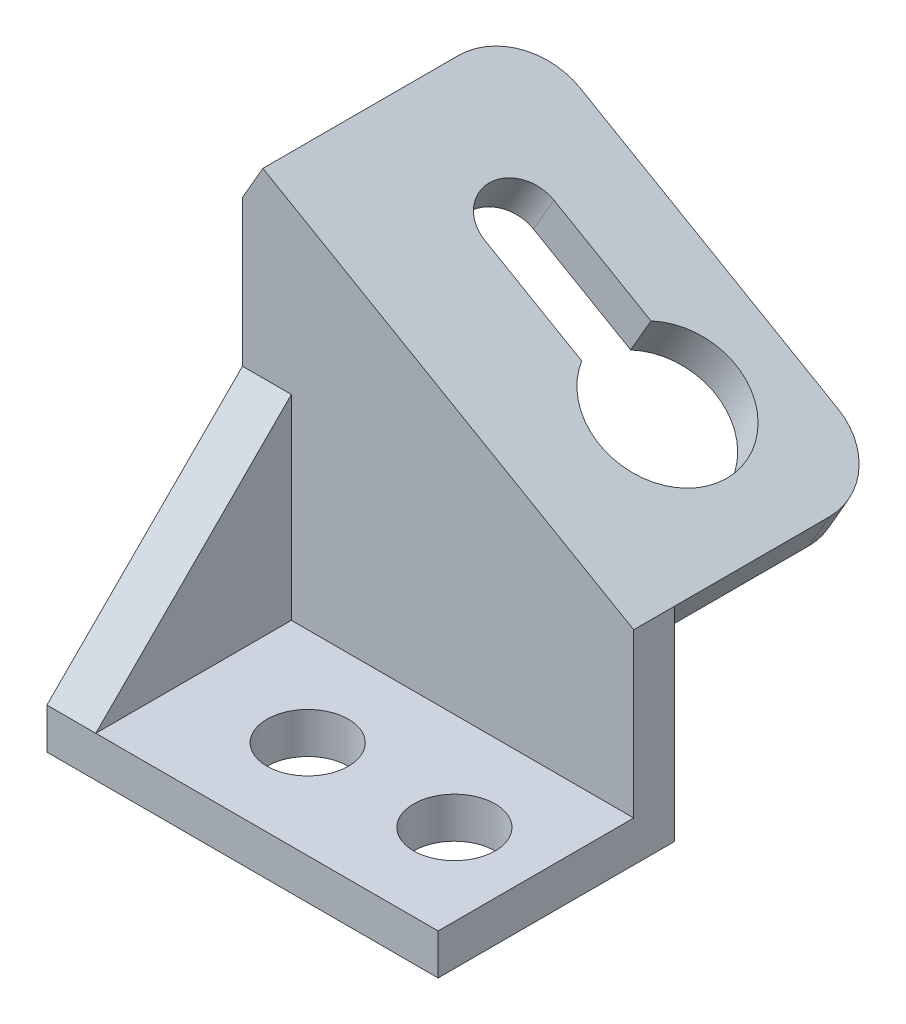
ISO-10303-21;
HEADER;
FILE_DESCRIPTION(('STEP AP214'),'2;1');
FILE_NAME('part.step','',(''),(''),'','','');
FILE_SCHEMA(('AUTOMOTIVE_DESIGN { 1 0 10303 214 1 1 1 1 }'));
ENDSEC;
DATA;
#1=APPLICATION_CONTEXT('core data for automotive mechanical design processes');
#2=APPLICATION_PROTOCOL_DEFINITION('international standard','automotive_design',2000,#1);
#3=PRODUCT_CONTEXT('',#1,'mechanical');
#4=PRODUCT('Part','Part','',(#3));
#5=PRODUCT_RELATED_PRODUCT_CATEGORY('part','',(#4));
#6=PRODUCT_DEFINITION_FORMATION('','',#4);
#7=PRODUCT_DEFINITION_CONTEXT('part definition',#1,'design');
#8=PRODUCT_DEFINITION('design','',#6,#7);
#9=PRODUCT_DEFINITION_SHAPE('','',#8);
#10=(LENGTH_UNIT() NAMED_UNIT(*) SI_UNIT(.MILLI.,.METRE.));
#11=(NAMED_UNIT(*) PLANE_ANGLE_UNIT() SI_UNIT($,.RADIAN.));
#12=(NAMED_UNIT(*) SI_UNIT($,.STERADIAN.) SOLID_ANGLE_UNIT());
#13=UNCERTAINTY_MEASURE_WITH_UNIT(LENGTH_MEASURE(1.E-05),#10,'distance_accuracy_value','');
#14=(GEOMETRIC_REPRESENTATION_CONTEXT(3) GLOBAL_UNCERTAINTY_ASSIGNED_CONTEXT((#13)) GLOBAL_UNIT_ASSIGNED_CONTEXT((#10,
#11,#12)) REPRESENTATION_CONTEXT('',''));
#15=CARTESIAN_POINT('',(0.,0.,0.));
#16=DIRECTION('',(0.,0.,1.));
#17=DIRECTION('',(1.,0.,0.));
#18=AXIS2_PLACEMENT_3D('',#15,#16,#17);
#19=CARTESIAN_POINT('',(32.7981532850781,56.8080678841871,0.));
#20=DIRECTION('',(0.500000000000001,0.866025403784438,0.));
#21=DIRECTION('',(-0.866025403784438,0.500000000000001,0.));
#22=AXIS2_PLACEMENT_3D('',#19,#20,#21);
#23=PLANE('',#22);
#24=DIRECTION('',(0.866025403784438,-0.500000000000001,0.));
#25=VECTOR('',#24,1.);
#26=CARTESIAN_POINT('',(-1.17961196366423E-13,75.7440905122497,-50.8));
#27=LINE('',#26,#25);
#28=CARTESIAN_POINT('',(14.9672726280624,67.1027316314033,-50.8));
#29=VERTEX_POINT('',#28);
#30=CARTESIAN_POINT('',(65.2014773719377,38.1,-50.8));
#31=VERTEX_POINT('',#30);
#32=EDGE_CURVE('E204',#29,#31,#27,.T.);
#33=ORIENTED_EDGE('',*,*,#32,.F.);
#34=CARTESIAN_POINT('',(14.9672726280623,67.1027316314033,-38.1));
#35=DIRECTION('',(0.500000000000001,0.866025403784438,0.));
#36=DIRECTION('',(-0.866025403784438,0.500000000000001,0.));
#37=AXIS2_PLACEMENT_3D('',#34,#35,#36);
#38=CIRCLE('',#37,12.7);
#39=CARTESIAN_POINT('',(3.96874999999997,73.4527316314033,-38.1));
#40=VERTEX_POINT('',#39);
#41=EDGE_CURVE('E274',#29,#40,#38,.T.);
#42=ORIENTED_EDGE('',*,*,#41,.T.);
#43=DIRECTION('',(0.,0.,-1.));
#44=VECTOR('',#43,1.);
#45=CARTESIAN_POINT('',(3.96874999999997,73.4527316314033,0.));
#46=LINE('',#45,#44);
#47=CARTESIAN_POINT('',(3.96874999999997,73.4527316314033,0.));
#48=VERTEX_POINT('',#47);
#49=EDGE_CURVE('E196',#48,#40,#46,.T.);
#50=ORIENTED_EDGE('',*,*,#49,.F.);
#51=DIRECTION('',(0.866025403784438,-0.500000000000001,0.));
#52=VECTOR('',#51,1.);
#53=CARTESIAN_POINT('',(-26.2151226684888,90.8793986417407,0.));
#54=LINE('',#53,#52);
#55=CARTESIAN_POINT('',(76.2,31.75,0.));
#56=VERTEX_POINT('',#55);
#57=EDGE_CURVE('E216',#48,#56,#54,.T.);
#58=ORIENTED_EDGE('',*,*,#57,.T.);
#59=DIRECTION('',(0.,0.,-1.));
#60=VECTOR('',#59,1.);
#61=CARTESIAN_POINT('',(76.2,31.75,0.));
#62=LINE('',#61,#60);
#63=CARTESIAN_POINT('',(76.2,31.75,-7.9375));
#64=VERTEX_POINT('',#63);
#65=EDGE_CURVE('E231',#56,#64,#62,.T.);
#66=ORIENTED_EDGE('',*,*,#65,.T.);
#67=DIRECTION('',(0.,0.,-1.));
#68=VECTOR('',#67,1.);
#69=CARTESIAN_POINT('',(76.2,31.75,0.));
#70=LINE('',#69,#68);
#71=CARTESIAN_POINT('',(76.2000000000001,31.75,-38.1));
#72=VERTEX_POINT('',#71);
#73=EDGE_CURVE('E199',#64,#72,#70,.T.);
#74=ORIENTED_EDGE('',*,*,#73,.T.);
#75=CARTESIAN_POINT('',(65.2014773719377,38.1,-38.1));
#76=DIRECTION('',(0.500000000000001,0.866025403784438,0.));
#77=DIRECTION('',(-0.866025403784438,0.500000000000001,0.));
#78=AXIS2_PLACEMENT_3D('',#75,#76,#77);
#79=CIRCLE('',#78,12.7);
#80=EDGE_CURVE('E272',#72,#31,#79,.T.);
#81=ORIENTED_EDGE('',*,*,#80,.T.);
#82=EDGE_LOOP('',(#33,#42,#50,#58,#66,#74,#81));
#83=FACE_BOUND('',#82,.T.);
#84=DIRECTION('',(0.866025403784438,-0.500000000000001,0.));
#85=VECTOR('',#84,1.);
#86=CARTESIAN_POINT('',(25.3318328451399,61.1187499998759,-21.828125));
#87=LINE('',#86,#85);
#88=CARTESIAN_POINT('',(25.3318328454266,61.1187499998759,-21.828125));
#89=VERTEX_POINT('',#88);
#90=CARTESIAN_POINT('',(44.2417084838831,50.2011282095052,-21.828125));
#91=VERTEX_POINT('',#90);
#92=EDGE_CURVE('E165',#89,#91,#87,.T.);
#93=ORIENTED_EDGE('',*,*,#92,.F.);
#94=CARTESIAN_POINT('',(25.3318328451399,61.1187499998759,-28.575));
#95=DIRECTION('',(-0.500000000000001,-0.866025403784438,0.));
#96=DIRECTION('',(0.866025403784438,-0.500000000000001,0.));
#97=AXIS2_PLACEMENT_3D('',#94,#95,#96);
#98=CIRCLE('',#97,6.746875);
#99=CARTESIAN_POINT('',(25.3318328451399,61.1187499998759,-35.321875));
#100=VERTEX_POINT('',#99);
#101=EDGE_CURVE('E47',#89,#100,#98,.T.);
#102=ORIENTED_EDGE('',*,*,#101,.T.);
#103=DIRECTION('',(0.866025403784438,-0.500000000000001,0.));
#104=VECTOR('',#103,1.);
#105=CARTESIAN_POINT('',(25.3318328451399,61.1187499998759,-35.321875));
#106=LINE('',#105,#104);
#107=CARTESIAN_POINT('',(44.2417084838831,50.2011282095052,-35.321875));
#108=VERTEX_POINT('',#107);
#109=EDGE_CURVE('E156',#100,#108,#106,.T.);
#110=ORIENTED_EDGE('',*,*,#109,.T.);
#111=CARTESIAN_POINT('',(54.2029547438036,44.4499999998759,-28.575));
#112=DIRECTION('',(-0.500000000000001,-0.866025403784438,0.));
#113=DIRECTION('',(0.866025403784438,-0.500000000000001,0.));
#114=AXIS2_PLACEMENT_3D('',#111,#112,#113);
#115=CIRCLE('',#114,13.335);
#116=EDGE_CURVE('E162',#108,#91,#115,.T.);
#117=ORIENTED_EDGE('',*,*,#116,.T.);
#118=EDGE_LOOP('',(#93,#102,#110,#117));
#119=FACE_BOUND('',#118,.T.);
#120=ADVANCED_FACE('F32',(#83,#119),#23,.T.);
#121=CARTESIAN_POINT('',(72.23125,24.875923357461,0.));
#122=DIRECTION('',(0.500000000000001,0.866025403784438,0.));
#123=DIRECTION('',(-0.866025403784438,0.500000000000001,0.));
#124=AXIS2_PLACEMENT_3D('',#121,#122,#123);
#125=PLANE('',#124);
#126=DIRECTION('',(0.,0.,1.));
#127=VECTOR('',#126,1.);
#128=CARTESIAN_POINT('',(0.,66.5786549888643,0.));
#129=LINE('',#128,#127);
#130=CARTESIAN_POINT('',(0.,66.5786549888643,-38.1));
#131=VERTEX_POINT('',#130);
#132=CARTESIAN_POINT('',(0.,66.5786549888643,-7.9375));
#133=VERTEX_POINT('',#132);
#134=EDGE_CURVE('E259',#131,#133,#129,.T.);
#135=ORIENTED_EDGE('',*,*,#134,.F.);
#136=CARTESIAN_POINT('',(10.9985226280623,60.2286549888643,-38.1));
#137=DIRECTION('',(0.500000000000001,0.866025403784438,0.));
#138=DIRECTION('',(-0.866025403784438,0.500000000000001,0.));
#139=AXIS2_PLACEMENT_3D('',#136,#137,#138);
#140=CIRCLE('',#139,12.7);
#141=CARTESIAN_POINT('',(10.9985226280623,60.2286549888643,-50.8));
#142=VERTEX_POINT('',#141);
#143=EDGE_CURVE('E266',#131,#142,#140,.F.);
#144=ORIENTED_EDGE('',*,*,#143,.T.);
#145=DIRECTION('',(0.866025403784438,-0.500000000000001,0.));
#146=VECTOR('',#145,1.);
#147=CARTESIAN_POINT('',(-3.96875000000013,68.8700138697107,-50.8));
#148=LINE('',#147,#146);
#149=CARTESIAN_POINT('',(61.2327273719377,31.225923357461,-50.8));
#150=VERTEX_POINT('',#149);
#151=EDGE_CURVE('E203',#142,#150,#148,.T.);
#152=ORIENTED_EDGE('',*,*,#151,.T.);
#153=CARTESIAN_POINT('',(61.2327273719377,31.225923357461,-38.1));
#154=DIRECTION('',(0.500000000000001,0.866025403784438,0.));
#155=DIRECTION('',(-0.866025403784438,0.500000000000001,0.));
#156=AXIS2_PLACEMENT_3D('',#153,#154,#155);
#157=CIRCLE('',#156,12.7);
#158=CARTESIAN_POINT('',(72.23125,24.875923357461,-38.1));
#159=VERTEX_POINT('',#158);
#160=EDGE_CURVE('E264',#150,#159,#157,.F.);
#161=ORIENTED_EDGE('',*,*,#160,.T.);
#162=DIRECTION('',(0.,0.,-1.));
#163=VECTOR('',#162,1.);
#164=CARTESIAN_POINT('',(72.23125,24.875923357461,0.));
#165=LINE('',#164,#163);
#166=CARTESIAN_POINT('',(72.23125,24.875923357461,-7.9375));
#167=VERTEX_POINT('',#166);
#168=EDGE_CURVE('E200',#167,#159,#165,.T.);
#169=ORIENTED_EDGE('',*,*,#168,.F.);
#170=DIRECTION('',(0.866025403784438,-0.500000000000001,0.));
#171=VECTOR('',#170,1.);
#172=CARTESIAN_POINT('',(85.979403285078,16.938423357461,-7.9375));
#173=LINE('',#172,#171);
#174=EDGE_CURVE('E213',#133,#167,#173,.T.);
#175=ORIENTED_EDGE('',*,*,#174,.F.);
#176=EDGE_LOOP('',(#135,#144,#152,#161,#169,#175));
#177=FACE_BOUND('',#176,.T.);
#178=CARTESIAN_POINT('',(21.3630828452116,54.2446733574611,-28.575));
#179=DIRECTION('',(0.500000000000001,0.866025403784438,0.));
#180=DIRECTION('',(-0.866025403784438,0.500000000000001,0.));
#181=AXIS2_PLACEMENT_3D('',#178,#179,#180);
#182=CIRCLE('',#181,6.746875);
#183=CARTESIAN_POINT('',(21.3630828452116,54.2446733574611,-21.828125));
#184=VERTEX_POINT('',#183);
#185=CARTESIAN_POINT('',(21.3630828452116,54.2446733574611,-35.321875));
#186=VERTEX_POINT('',#185);
#187=EDGE_CURVE('E11',#184,#186,#182,.F.);
#188=ORIENTED_EDGE('',*,*,#187,.F.);
#189=DIRECTION('',(0.866025403784438,-0.500000000000001,0.));
#190=VECTOR('',#189,1.);
#191=CARTESIAN_POINT('',(72.23125,24.875923357461,-21.828125));
#192=LINE('',#191,#190);
#193=CARTESIAN_POINT('',(40.2729584839548,43.3270515670903,-21.828125));
#194=VERTEX_POINT('',#193);
#195=EDGE_CURVE('E279',#184,#194,#192,.T.);
#196=ORIENTED_EDGE('',*,*,#195,.T.);
#197=CARTESIAN_POINT('',(50.2342047438753,37.5759233574611,-28.575));
#198=DIRECTION('',(0.500000000000001,0.866025403784438,0.));
#199=DIRECTION('',(-0.866025403784438,0.500000000000001,0.));
#200=AXIS2_PLACEMENT_3D('',#197,#198,#199);
#201=CIRCLE('',#200,13.335);
#202=CARTESIAN_POINT('',(40.2729584839548,43.3270515670903,-35.321875));
#203=VERTEX_POINT('',#202);
#204=EDGE_CURVE('E282',#203,#194,#201,.F.);
#205=ORIENTED_EDGE('',*,*,#204,.F.);
#206=DIRECTION('',(0.866025403784438,-0.500000000000001,0.));
#207=VECTOR('',#206,1.);
#208=CARTESIAN_POINT('',(72.23125,24.875923357461,-35.321875));
#209=LINE('',#208,#207);
#210=EDGE_CURVE('E40',#186,#203,#209,.T.);
#211=ORIENTED_EDGE('',*,*,#210,.F.);
#212=EDGE_LOOP('',(#188,#196,#205,#211));
#213=FACE_BOUND('',#212,.T.);
#214=ADVANCED_FACE('F287',(#177,#213),#125,.F.);
#215=CARTESIAN_POINT('',(76.2,0.,0.));
#216=DIRECTION('',(0.,0.,-1.));
#217=DIRECTION('',(-1.,0.,0.));
#218=AXIS2_PLACEMENT_3D('',#215,#216,#217);
#219=PLANE('',#218);
#220=DIRECTION('',(0.,-1.,0.));
#221=VECTOR('',#220,1.);
#222=CARTESIAN_POINT('',(0.,0.,0.));
#223=LINE('',#222,#221);
#224=CARTESIAN_POINT('',(0.,66.5786549888644,0.));
#225=VERTEX_POINT('',#224);
#226=CARTESIAN_POINT('',(0.,38.1,0.));
#227=VERTEX_POINT('',#226);
#228=EDGE_CURVE('E222',#225,#227,#223,.T.);
#229=ORIENTED_EDGE('',*,*,#228,.T.);
#230=DIRECTION('',(-1.,0.,0.));
#231=VECTOR('',#230,1.);
#232=CARTESIAN_POINT('',(9.525,38.1,0.));
#233=LINE('',#232,#231);
#234=CARTESIAN_POINT('',(9.525,38.1,0.));
#235=VERTEX_POINT('',#234);
#236=EDGE_CURVE('E190',#235,#227,#233,.T.);
#237=ORIENTED_EDGE('',*,*,#236,.F.);
#238=DIRECTION('',(0.,-1.,0.));
#239=VECTOR('',#238,1.);
#240=CARTESIAN_POINT('',(9.525,38.1,0.));
#241=LINE('',#240,#239);
#242=CARTESIAN_POINT('',(9.525,0.,0.));
#243=VERTEX_POINT('',#242);
#244=EDGE_CURVE('E184',#235,#243,#241,.T.);
#245=ORIENTED_EDGE('',*,*,#244,.T.);
#246=DIRECTION('',(-1.,0.,0.));
#247=VECTOR('',#246,1.);
#248=CARTESIAN_POINT('',(76.2,0.,0.));
#249=LINE('',#248,#247);
#250=CARTESIAN_POINT('',(76.2,0.,0.));
#251=VERTEX_POINT('',#250);
#252=EDGE_CURVE('E236',#251,#243,#249,.T.);
#253=ORIENTED_EDGE('',*,*,#252,.F.);
#254=DIRECTION('',(0.,-1.,0.));
#255=VECTOR('',#254,1.);
#256=CARTESIAN_POINT('',(76.2,0.,0.));
#257=LINE('',#256,#255);
#258=EDGE_CURVE('E234',#56,#251,#257,.T.);
#259=ORIENTED_EDGE('',*,*,#258,.F.);
#260=ORIENTED_EDGE('',*,*,#57,.F.);
#261=DIRECTION('',(0.5,0.866025403784438,0.));
#262=VECTOR('',#261,1.);
#263=CARTESIAN_POINT('',(0.,66.5786549888644,0.));
#264=LINE('',#263,#262);
#265=EDGE_CURVE('E192',#225,#48,#264,.T.);
#266=ORIENTED_EDGE('',*,*,#265,.F.);
#267=EDGE_LOOP('',(#229,#237,#245,#253,#259,#260,#266));
#268=FACE_BOUND('',#267,.T.);
#269=ADVANCED_FACE('F306',(#268),#219,.F.);
#270=CARTESIAN_POINT('',(-3.96875000000013,68.8700138697107,-50.8));
#271=DIRECTION('',(0.,0.,1.));
#272=DIRECTION('',(1.,0.,0.));
#273=AXIS2_PLACEMENT_3D('',#270,#271,#272);
#274=PLANE('',#273);
#275=ORIENTED_EDGE('',*,*,#151,.F.);
#276=DIRECTION('',(-0.5,-0.866025403784438,0.));
#277=VECTOR('',#276,1.);
#278=CARTESIAN_POINT('',(14.9672726280623,67.1027316314033,-50.8));
#279=LINE('',#278,#277);
#280=EDGE_CURVE('E270',#142,#29,#279,.F.);
#281=ORIENTED_EDGE('',*,*,#280,.T.);
#282=ORIENTED_EDGE('',*,*,#32,.T.);
#283=DIRECTION('',(0.500000000000001,0.866025403784438,0.));
#284=VECTOR('',#283,1.);
#285=CARTESIAN_POINT('',(61.2327273719377,31.225923357461,-50.8));
#286=LINE('',#285,#284);
#287=EDGE_CURVE('E268',#31,#150,#286,.F.);
#288=ORIENTED_EDGE('',*,*,#287,.T.);
#289=EDGE_LOOP('',(#275,#281,#282,#288));
#290=FACE_BOUND('',#289,.T.);
#291=ADVANCED_FACE('F323',(#290),#274,.F.);
#292=CARTESIAN_POINT('',(0.,0.,38.1));
#293=DIRECTION('',(-1.,0.,0.));
#294=DIRECTION('',(0.,0.,1.));
#295=AXIS2_PLACEMENT_3D('',#292,#293,#294);
#296=PLANE('',#295);
#297=ORIENTED_EDGE('',*,*,#228,.F.);
#298=DIRECTION('',(0.,0.,-1.));
#299=VECTOR('',#298,1.);
#300=CARTESIAN_POINT('',(0.,66.5786549888643,38.1));
#301=LINE('',#300,#299);
#302=EDGE_CURVE('E256',#225,#133,#301,.T.);
#303=ORIENTED_EDGE('',*,*,#302,.T.);
#304=DIRECTION('',(0.,1.,0.));
#305=VECTOR('',#304,1.);
#306=CARTESIAN_POINT('',(0.,0.,-7.9375));
#307=LINE('',#306,#305);
#308=CARTESIAN_POINT('',(0.,-7.9375,-7.9375));
#309=VERTEX_POINT('',#308);
#310=EDGE_CURVE('E242',#133,#309,#307,.F.);
#311=ORIENTED_EDGE('',*,*,#310,.T.);
#312=DIRECTION('',(0.,0.,1.));
#313=VECTOR('',#312,1.);
#314=CARTESIAN_POINT('',(0.,-7.9375,0.));
#315=LINE('',#314,#313);
#316=CARTESIAN_POINT('',(0.,-7.93749999999999,38.1));
#317=VERTEX_POINT('',#316);
#318=EDGE_CURVE('E239',#309,#317,#315,.T.);
#319=ORIENTED_EDGE('',*,*,#318,.T.);
#320=DIRECTION('',(0.,1.,0.));
#321=VECTOR('',#320,1.);
#322=CARTESIAN_POINT('',(0.,-7.93749999999999,38.1));
#323=LINE('',#322,#321);
#324=CARTESIAN_POINT('',(0.,0.,38.1));
#325=VERTEX_POINT('',#324);
#326=EDGE_CURVE('E218',#317,#325,#323,.T.);
#327=ORIENTED_EDGE('',*,*,#326,.T.);
#328=DIRECTION('',(0.,0.707106781186547,-0.707106781186548));
#329=VECTOR('',#328,1.);
#330=CARTESIAN_POINT('',(0.,0.,38.1));
#331=LINE('',#330,#329);
#332=EDGE_CURVE('E152',#325,#227,#331,.T.);
#333=ORIENTED_EDGE('',*,*,#332,.T.);
#334=EDGE_LOOP('',(#297,#303,#311,#319,#327,#333));
#335=FACE_BOUND('',#334,.T.);
#336=ADVANCED_FACE('F319',(#335),#296,.T.);
#337=CARTESIAN_POINT('',(76.2,0.,0.));
#338=DIRECTION('',(0.,-1.,0.));
#339=DIRECTION('',(0.,0.,-1.));
#340=AXIS2_PLACEMENT_3D('',#337,#338,#339);
#341=PLANE('',#340);
#342=CARTESIAN_POINT('',(31.75,0.,19.05));
#343=DIRECTION('',(0.,1.,0.));
#344=DIRECTION('',(0.,0.,1.));
#345=AXIS2_PLACEMENT_3D('',#342,#343,#344);
#346=CIRCLE('',#345,7.9375);
#347=CARTESIAN_POINT('',(31.75,0.,26.9875));
#348=VERTEX_POINT('',#347);
#349=EDGE_CURVE('E449',#348,#348,#346,.T.);
#350=ORIENTED_EDGE('',*,*,#349,.F.);
#351=EDGE_LOOP('',(#350));
#352=FACE_BOUND('',#351,.T.);
#353=CARTESIAN_POINT('',(60.325,0.,19.05));
#354=DIRECTION('',(0.,1.,0.));
#355=DIRECTION('',(0.,0.,1.));
#356=AXIS2_PLACEMENT_3D('',#353,#354,#355);
#357=CIRCLE('',#356,7.9375);
#358=CARTESIAN_POINT('',(60.325,0.,26.9875));
#359=VERTEX_POINT('',#358);
#360=EDGE_CURVE('E169',#359,#359,#357,.T.);
#361=ORIENTED_EDGE('',*,*,#360,.F.);
#362=EDGE_LOOP('',(#361));
#363=FACE_BOUND('',#362,.T.);
#364=ORIENTED_EDGE('',*,*,#252,.T.);
#365=DIRECTION('',(0.,0.,1.));
#366=VECTOR('',#365,1.);
#367=CARTESIAN_POINT('',(9.525,0.,0.));
#368=LINE('',#367,#366);
#369=CARTESIAN_POINT('',(9.525,0.,38.1));
#370=VERTEX_POINT('',#369);
#371=EDGE_CURVE('E179',#243,#370,#368,.T.);
#372=ORIENTED_EDGE('',*,*,#371,.T.);
#373=DIRECTION('',(-1.,0.,0.));
#374=VECTOR('',#373,1.);
#375=CARTESIAN_POINT('',(76.2,0.,38.1));
#376=LINE('',#375,#374);
#377=CARTESIAN_POINT('',(76.2,0.,38.1));
#378=VERTEX_POINT('',#377);
#379=EDGE_CURVE('E253',#378,#370,#376,.T.);
#380=ORIENTED_EDGE('',*,*,#379,.F.);
#381=DIRECTION('',(0.,0.,1.));
#382=VECTOR('',#381,1.);
#383=CARTESIAN_POINT('',(76.2,0.,0.));
#384=LINE('',#383,#382);
#385=EDGE_CURVE('E219',#251,#378,#384,.T.);
#386=ORIENTED_EDGE('',*,*,#385,.F.);
#387=EDGE_LOOP('',(#364,#372,#380,#386));
#388=FACE_BOUND('',#387,.T.);
#389=ADVANCED_FACE('F322',(#352,#363,#388),#341,.F.);
#390=CARTESIAN_POINT('',(76.2,-7.93749999999999,38.1));
#391=DIRECTION('',(0.,0.,1.));
#392=DIRECTION('',(1.,0.,0.));
#393=AXIS2_PLACEMENT_3D('',#390,#391,#392);
#394=PLANE('',#393);
#395=ORIENTED_EDGE('',*,*,#326,.F.);
#396=DIRECTION('',(-1.,0.,0.));
#397=VECTOR('',#396,1.);
#398=CARTESIAN_POINT('',(76.2,-7.93749999999999,38.1));
#399=LINE('',#398,#397);
#400=CARTESIAN_POINT('',(76.2,-7.93749999999999,38.1));
#401=VERTEX_POINT('',#400);
#402=EDGE_CURVE('E251',#401,#317,#399,.T.);
#403=ORIENTED_EDGE('',*,*,#402,.F.);
#404=DIRECTION('',(0.,1.,0.));
#405=VECTOR('',#404,1.);
#406=CARTESIAN_POINT('',(76.2,-7.93749999999999,38.1));
#407=LINE('',#406,#405);
#408=EDGE_CURVE('E221',#401,#378,#407,.T.);
#409=ORIENTED_EDGE('',*,*,#408,.T.);
#410=ORIENTED_EDGE('',*,*,#379,.T.);
#411=DIRECTION('',(-1.,0.,0.));
#412=VECTOR('',#411,1.);
#413=CARTESIAN_POINT('',(9.525,0.,38.1));
#414=LINE('',#413,#412);
#415=EDGE_CURVE('E187',#370,#325,#414,.T.);
#416=ORIENTED_EDGE('',*,*,#415,.T.);
#417=EDGE_LOOP('',(#395,#403,#409,#410,#416));
#418=FACE_BOUND('',#417,.T.);
#419=ADVANCED_FACE('F334',(#418),#394,.T.);
#420=CARTESIAN_POINT('',(76.2,-7.9375,0.));
#421=DIRECTION('',(0.,-1.,0.));
#422=DIRECTION('',(0.,0.,-1.));
#423=AXIS2_PLACEMENT_3D('',#420,#421,#422);
#424=PLANE('',#423);
#425=CARTESIAN_POINT('',(31.75,-7.93750000000001,19.05));
#426=DIRECTION('',(0.,1.,0.));
#427=DIRECTION('',(0.,0.,1.));
#428=AXIS2_PLACEMENT_3D('',#425,#426,#427);
#429=CIRCLE('',#428,7.9375);
#430=CARTESIAN_POINT('',(31.75,-7.9375,26.9875));
#431=VERTEX_POINT('',#430);
#432=EDGE_CURVE('E446',#431,#431,#429,.T.);
#433=ORIENTED_EDGE('',*,*,#432,.T.);
#434=EDGE_LOOP('',(#433));
#435=FACE_BOUND('',#434,.T.);
#436=CARTESIAN_POINT('',(60.325,-7.93750000000001,19.05));
#437=DIRECTION('',(0.,1.,0.));
#438=DIRECTION('',(0.,0.,1.));
#439=AXIS2_PLACEMENT_3D('',#436,#437,#438);
#440=CIRCLE('',#439,7.9375);
#441=CARTESIAN_POINT('',(60.325,-7.9375,26.9875));
#442=VERTEX_POINT('',#441);
#443=EDGE_CURVE('E166',#442,#442,#440,.T.);
#444=ORIENTED_EDGE('',*,*,#443,.T.);
#445=EDGE_LOOP('',(#444));
#446=FACE_BOUND('',#445,.T.);
#447=ORIENTED_EDGE('',*,*,#318,.F.);
#448=DIRECTION('',(-1.,0.,0.));
#449=VECTOR('',#448,1.);
#450=CARTESIAN_POINT('',(76.2,-7.9375,-7.9375));
#451=LINE('',#450,#449);
#452=CARTESIAN_POINT('',(76.2,-7.9375,-7.9375));
#453=VERTEX_POINT('',#452);
#454=EDGE_CURVE('E248',#453,#309,#451,.T.);
#455=ORIENTED_EDGE('',*,*,#454,.F.);
#456=DIRECTION('',(0.,0.,1.));
#457=VECTOR('',#456,1.);
#458=CARTESIAN_POINT('',(76.2,-7.9375,0.));
#459=LINE('',#458,#457);
#460=EDGE_CURVE('E225',#453,#401,#459,.T.);
#461=ORIENTED_EDGE('',*,*,#460,.T.);
#462=ORIENTED_EDGE('',*,*,#402,.T.);
#463=EDGE_LOOP('',(#447,#455,#461,#462));
#464=FACE_BOUND('',#463,.T.);
#465=ADVANCED_FACE('F330',(#435,#446,#464),#424,.T.);
#466=CARTESIAN_POINT('',(76.2,0.,-7.9375));
#467=DIRECTION('',(0.,0.,-1.));
#468=DIRECTION('',(-1.,0.,0.));
#469=AXIS2_PLACEMENT_3D('',#466,#467,#468);
#470=PLANE('',#469);
#471=DIRECTION('',(-0.500000000000001,-0.866025403784438,0.));
#472=VECTOR('',#471,1.);
#473=CARTESIAN_POINT('',(62.451846714922,7.93750000000002,-7.9375));
#474=LINE('',#473,#472);
#475=EDGE_CURVE('E207',#64,#167,#474,.T.);
#476=ORIENTED_EDGE('',*,*,#475,.F.);
#477=DIRECTION('',(0.,1.,0.));
#478=VECTOR('',#477,1.);
#479=CARTESIAN_POINT('',(76.2,0.,-7.9375));
#480=LINE('',#479,#478);
#481=EDGE_CURVE('E228',#64,#453,#480,.F.);
#482=ORIENTED_EDGE('',*,*,#481,.T.);
#483=ORIENTED_EDGE('',*,*,#454,.T.);
#484=ORIENTED_EDGE('',*,*,#310,.F.);
#485=ORIENTED_EDGE('',*,*,#174,.T.);
#486=EDGE_LOOP('',(#476,#482,#483,#484,#485));
#487=FACE_BOUND('',#486,.T.);
#488=ADVANCED_FACE('F317',(#487),#470,.T.);
#489=CARTESIAN_POINT('',(76.2,0.,38.1));
#490=DIRECTION('',(-1.,0.,0.));
#491=DIRECTION('',(0.,0.,1.));
#492=AXIS2_PLACEMENT_3D('',#489,#490,#491);
#493=PLANE('',#492);
#494=ORIENTED_EDGE('',*,*,#385,.T.);
#495=ORIENTED_EDGE('',*,*,#408,.F.);
#496=ORIENTED_EDGE('',*,*,#460,.F.);
#497=ORIENTED_EDGE('',*,*,#481,.F.);
#498=ORIENTED_EDGE('',*,*,#65,.F.);
#499=ORIENTED_EDGE('',*,*,#258,.T.);
#500=EDGE_LOOP('',(#494,#495,#496,#497,#498,#499));
#501=FACE_BOUND('',#500,.T.);
#502=ADVANCED_FACE('F314',(#501),#493,.F.);
#503=CARTESIAN_POINT('',(72.23125,24.875923357461,0.));
#504=DIRECTION('',(0.866025403784438,-0.500000000000001,0.));
#505=DIRECTION('',(0.500000000000001,0.866025403784438,0.));
#506=AXIS2_PLACEMENT_3D('',#503,#504,#505);
#507=PLANE('',#506);
#508=ORIENTED_EDGE('',*,*,#168,.T.);
#509=DIRECTION('',(0.500000000000001,0.866025403784438,0.));
#510=VECTOR('',#509,1.);
#511=CARTESIAN_POINT('',(76.2000000000001,31.75,-38.1));
#512=LINE('',#511,#510);
#513=EDGE_CURVE('E276',#159,#72,#512,.T.);
#514=ORIENTED_EDGE('',*,*,#513,.T.);
#515=ORIENTED_EDGE('',*,*,#73,.F.);
#516=ORIENTED_EDGE('',*,*,#475,.T.);
#517=EDGE_LOOP('',(#508,#514,#515,#516));
#518=FACE_BOUND('',#517,.T.);
#519=ADVANCED_FACE('F312',(#518),#507,.T.);
#520=CARTESIAN_POINT('',(0.,66.5786549888644,0.));
#521=DIRECTION('',(-0.866025403784438,0.5,0.));
#522=DIRECTION('',(-0.5,-0.866025403784438,0.));
#523=AXIS2_PLACEMENT_3D('',#520,#521,#522);
#524=PLANE('',#523);
#525=ORIENTED_EDGE('',*,*,#49,.T.);
#526=DIRECTION('',(-0.5,-0.866025403784438,0.));
#527=VECTOR('',#526,1.);
#528=CARTESIAN_POINT('',(0.,66.5786549888644,-38.1));
#529=LINE('',#528,#527);
#530=EDGE_CURVE('E261',#40,#131,#529,.T.);
#531=ORIENTED_EDGE('',*,*,#530,.T.);
#532=ORIENTED_EDGE('',*,*,#134,.T.);
#533=ORIENTED_EDGE('',*,*,#302,.F.);
#534=ORIENTED_EDGE('',*,*,#265,.T.);
#535=EDGE_LOOP('',(#525,#531,#532,#533,#534));
#536=FACE_BOUND('',#535,.T.);
#537=ADVANCED_FACE('F343',(#536),#524,.T.);
#538=CARTESIAN_POINT('',(10.9985226280624,60.2286549888644,-38.1));
#539=DIRECTION('',(0.5,0.866025403784438,0.));
#540=DIRECTION('',(-0.866025403784438,0.5,0.));
#541=AXIS2_PLACEMENT_3D('',#538,#539,#540);
#542=CYLINDRICAL_SURFACE('',#541,12.7);
#543=ORIENTED_EDGE('',*,*,#41,.F.);
#544=ORIENTED_EDGE('',*,*,#280,.F.);
#545=ORIENTED_EDGE('',*,*,#143,.F.);
#546=ORIENTED_EDGE('',*,*,#530,.F.);
#547=EDGE_LOOP('',(#543,#544,#545,#546));
#548=FACE_BOUND('',#547,.T.);
#549=ADVANCED_FACE('F341',(#548),#542,.T.);
#550=CARTESIAN_POINT('',(61.2327273719377,31.225923357461,-38.1));
#551=DIRECTION('',(-0.500000000000001,-0.866025403784438,0.));
#552=DIRECTION('',(0.866025403784438,-0.500000000000001,0.));
#553=AXIS2_PLACEMENT_3D('',#550,#551,#552);
#554=CYLINDRICAL_SURFACE('',#553,12.7);
#555=ORIENTED_EDGE('',*,*,#160,.F.);
#556=ORIENTED_EDGE('',*,*,#287,.F.);
#557=ORIENTED_EDGE('',*,*,#80,.F.);
#558=ORIENTED_EDGE('',*,*,#513,.F.);
#559=EDGE_LOOP('',(#555,#556,#557,#558));
#560=FACE_BOUND('',#559,.T.);
#561=ADVANCED_FACE('F34',(#560),#554,.T.);
#562=CARTESIAN_POINT('',(9.525,0.,38.1));
#563=DIRECTION('',(0.,0.707106781186548,0.707106781186547));
#564=DIRECTION('',(0.,-0.707106781186547,0.707106781186548));
#565=AXIS2_PLACEMENT_3D('',#562,#563,#564);
#566=PLANE('',#565);
#567=ORIENTED_EDGE('',*,*,#332,.F.);
#568=ORIENTED_EDGE('',*,*,#415,.F.);
#569=DIRECTION('',(0.,0.707106781186547,-0.707106781186548));
#570=VECTOR('',#569,1.);
#571=CARTESIAN_POINT('',(9.525,0.,38.1));
#572=LINE('',#571,#570);
#573=EDGE_CURVE('E182',#370,#235,#572,.T.);
#574=ORIENTED_EDGE('',*,*,#573,.T.);
#575=ORIENTED_EDGE('',*,*,#236,.T.);
#576=EDGE_LOOP('',(#567,#568,#574,#575));
#577=FACE_BOUND('',#576,.T.);
#578=ADVANCED_FACE('F349',(#577),#566,.T.);
#579=CARTESIAN_POINT('',(9.525,0.,0.));
#580=DIRECTION('',(1.,0.,0.));
#581=DIRECTION('',(0.,0.,-1.));
#582=AXIS2_PLACEMENT_3D('',#579,#580,#581);
#583=PLANE('',#582);
#584=ORIENTED_EDGE('',*,*,#371,.F.);
#585=ORIENTED_EDGE('',*,*,#244,.F.);
#586=ORIENTED_EDGE('',*,*,#573,.F.);
#587=EDGE_LOOP('',(#584,#585,#586));
#588=FACE_BOUND('',#587,.T.);
#589=ADVANCED_FACE('F374',(#588),#583,.T.);
#590=CARTESIAN_POINT('',(-10.903358761136,-1.64244288418706,-28.575));
#591=DIRECTION('',(0.500000000000001,0.866025403784438,0.));
#592=DIRECTION('',(-0.866025403784438,0.500000000000001,0.));
#593=AXIS2_PLACEMENT_3D('',#590,#591,#592);
#594=CYLINDRICAL_SURFACE('',#593,6.746875);
#595=ORIENTED_EDGE('',*,*,#187,.T.);
#596=DIRECTION('',(0.500000000000001,0.866025403784438,0.));
#597=VECTOR('',#596,1.);
#598=CARTESIAN_POINT('',(-10.903358761136,-1.64244288418706,-35.321875));
#599=LINE('',#598,#597);
#600=EDGE_CURVE('E146',#186,#100,#599,.T.);
#601=ORIENTED_EDGE('',*,*,#600,.T.);
#602=ORIENTED_EDGE('',*,*,#101,.F.);
#603=DIRECTION('',(0.500000000000001,0.866025403784438,0.));
#604=VECTOR('',#603,1.);
#605=CARTESIAN_POINT('',(-10.903358761136,-1.64244288418706,-21.828125));
#606=LINE('',#605,#604);
#607=EDGE_CURVE('E175',#184,#89,#606,.T.);
#608=ORIENTED_EDGE('',*,*,#607,.F.);
#609=EDGE_LOOP('',(#595,#601,#602,#608));
#610=FACE_BOUND('',#609,.T.);
#611=ADVANCED_FACE('F148',(#610),#594,.F.);
#612=CARTESIAN_POINT('',(-10.903358761136,-1.64244288418706,-35.321875));
#613=DIRECTION('',(0.,0.,1.));
#614=DIRECTION('',(1.,0.,0.));
#615=AXIS2_PLACEMENT_3D('',#612,#613,#614);
#616=PLANE('',#615);
#617=ORIENTED_EDGE('',*,*,#210,.T.);
#618=DIRECTION('',(0.500000000000001,0.866025403784438,0.));
#619=VECTOR('',#618,1.);
#620=CARTESIAN_POINT('',(8.00651687760719,-12.5600646745578,-35.321875));
#621=LINE('',#620,#619);
#622=EDGE_CURVE('E153',#203,#108,#621,.T.);
#623=ORIENTED_EDGE('',*,*,#622,.T.);
#624=ORIENTED_EDGE('',*,*,#109,.F.);
#625=ORIENTED_EDGE('',*,*,#600,.F.);
#626=EDGE_LOOP('',(#617,#623,#624,#625));
#627=FACE_BOUND('',#626,.T.);
#628=ADVANCED_FACE('F157',(#627),#616,.T.);
#629=CARTESIAN_POINT('',(17.9677631375277,-18.3111928841871,-28.575));
#630=DIRECTION('',(0.500000000000001,0.866025403784438,0.));
#631=DIRECTION('',(-0.866025403784438,0.500000000000001,0.));
#632=AXIS2_PLACEMENT_3D('',#629,#630,#631);
#633=CYLINDRICAL_SURFACE('',#632,13.335);
#634=ORIENTED_EDGE('',*,*,#204,.T.);
#635=DIRECTION('',(0.500000000000001,0.866025403784438,0.));
#636=VECTOR('',#635,1.);
#637=CARTESIAN_POINT('',(8.0065168776072,-12.5600646745578,-21.828125));
#638=LINE('',#637,#636);
#639=EDGE_CURVE('E55',#194,#91,#638,.T.);
#640=ORIENTED_EDGE('',*,*,#639,.T.);
#641=ORIENTED_EDGE('',*,*,#116,.F.);
#642=ORIENTED_EDGE('',*,*,#622,.F.);
#643=EDGE_LOOP('',(#634,#640,#641,#642));
#644=FACE_BOUND('',#643,.T.);
#645=ADVANCED_FACE('F286',(#644),#633,.F.);
#646=CARTESIAN_POINT('',(-10.903358761136,-1.64244288418706,-21.828125));
#647=DIRECTION('',(0.,0.,1.));
#648=DIRECTION('',(1.,0.,0.));
#649=AXIS2_PLACEMENT_3D('',#646,#647,#648);
#650=PLANE('',#649);
#651=ORIENTED_EDGE('',*,*,#607,.T.);
#652=ORIENTED_EDGE('',*,*,#92,.T.);
#653=ORIENTED_EDGE('',*,*,#639,.F.);
#654=ORIENTED_EDGE('',*,*,#195,.F.);
#655=EDGE_LOOP('',(#651,#652,#653,#654));
#656=FACE_BOUND('',#655,.T.);
#657=ADVANCED_FACE('F288',(#656),#650,.F.);
#658=CARTESIAN_POINT('',(60.325,-7.93750000000001,19.05));
#659=DIRECTION('',(0.,1.,0.));
#660=DIRECTION('',(0.,0.,1.));
#661=AXIS2_PLACEMENT_3D('',#658,#659,#660);
#662=CYLINDRICAL_SURFACE('',#661,7.9375);
#663=ORIENTED_EDGE('',*,*,#443,.F.);
#664=EDGE_LOOP('',(#663));
#665=FACE_BOUND('',#664,.T.);
#666=ORIENTED_EDGE('',*,*,#360,.T.);
#667=EDGE_LOOP('',(#666));
#668=FACE_BOUND('',#667,.T.);
#669=ADVANCED_FACE('F290',(#665,#668),#662,.F.);
#670=CARTESIAN_POINT('',(31.75,-7.93750000000001,19.05));
#671=DIRECTION('',(0.,1.,0.));
#672=DIRECTION('',(0.,0.,1.));
#673=AXIS2_PLACEMENT_3D('',#670,#671,#672);
#674=CYLINDRICAL_SURFACE('',#673,7.9375);
#675=ORIENTED_EDGE('',*,*,#432,.F.);
#676=EDGE_LOOP('',(#675));
#677=FACE_BOUND('',#676,.T.);
#678=ORIENTED_EDGE('',*,*,#349,.T.);
#679=EDGE_LOOP('',(#678));
#680=FACE_BOUND('',#679,.T.);
#681=ADVANCED_FACE('F296',(#677,#680),#674,.F.);
#682=CLOSED_SHELL('',(#120,#214,#269,#291,#336,#389,#419,#465,#488,#502,#519,#537,#549,#561,
#578,#589,#611,#628,#645,#657,#669,#681));
#683=MANIFOLD_SOLID_BREP('B2',#682);
#684=ADVANCED_BREP_SHAPE_REPRESENTATION('',(#18,#683),#14);
#685=SHAPE_DEFINITION_REPRESENTATION(#9,#684);
ENDSEC;
END-ISO-10303-21;
